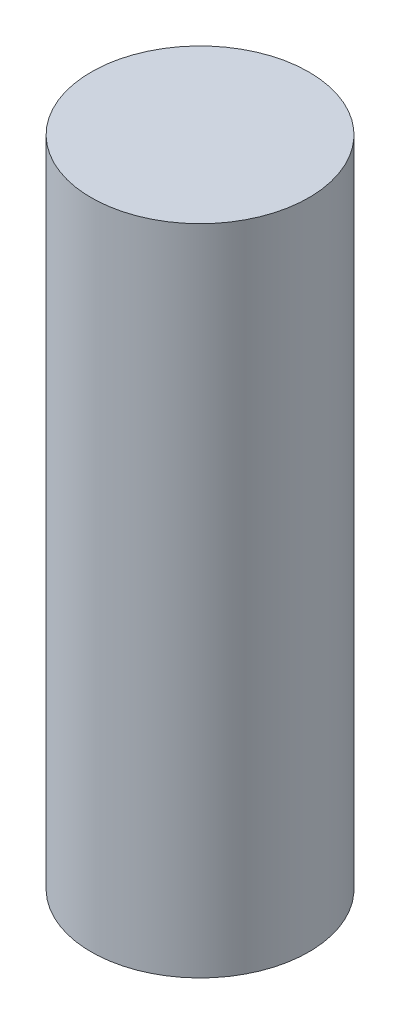
ISO-10303-21;
HEADER;
FILE_DESCRIPTION(('STEP AP214'),'2;1');
FILE_NAME('part.step','',(''),(''),'','','');
FILE_SCHEMA(('AUTOMOTIVE_DESIGN { 1 0 10303 214 1 1 1 1 }'));
ENDSEC;
DATA;
#1=APPLICATION_CONTEXT('core data for automotive mechanical design processes');
#2=APPLICATION_PROTOCOL_DEFINITION('international standard','automotive_design',2000,#1);
#3=PRODUCT_CONTEXT('',#1,'mechanical');
#4=PRODUCT('Part','Part','',(#3));
#5=PRODUCT_RELATED_PRODUCT_CATEGORY('part','',(#4));
#6=PRODUCT_DEFINITION_FORMATION('','',#4);
#7=PRODUCT_DEFINITION_CONTEXT('part definition',#1,'design');
#8=PRODUCT_DEFINITION('design','',#6,#7);
#9=PRODUCT_DEFINITION_SHAPE('','',#8);
#10=(LENGTH_UNIT() NAMED_UNIT(*) SI_UNIT(.MILLI.,.METRE.));
#11=(NAMED_UNIT(*) PLANE_ANGLE_UNIT() SI_UNIT($,.RADIAN.));
#12=(NAMED_UNIT(*) SI_UNIT($,.STERADIAN.) SOLID_ANGLE_UNIT());
#13=UNCERTAINTY_MEASURE_WITH_UNIT(LENGTH_MEASURE(1.E-05),#10,'distance_accuracy_value','');
#14=(GEOMETRIC_REPRESENTATION_CONTEXT(3) GLOBAL_UNCERTAINTY_ASSIGNED_CONTEXT((#13)) GLOBAL_UNIT_ASSIGNED_CONTEXT((#10,
#11,#12)) REPRESENTATION_CONTEXT('',''));
#15=CARTESIAN_POINT('',(0.,0.,0.));
#16=DIRECTION('',(0.,0.,1.));
#17=DIRECTION('',(1.,0.,0.));
#18=AXIS2_PLACEMENT_3D('',#15,#16,#17);
#19=CARTESIAN_POINT('',(0.,4.7625,0.));
#20=DIRECTION('',(0.,-1.,0.));
#21=DIRECTION('',(0.,0.,-1.));
#22=AXIS2_PLACEMENT_3D('',#19,#20,#21);
#23=CYLINDRICAL_SURFACE('',#22,1.5875);
#24=CARTESIAN_POINT('',(0.,4.7625,0.));
#25=DIRECTION('',(0.,1.,0.));
#26=DIRECTION('',(0.,0.,1.));
#27=AXIS2_PLACEMENT_3D('',#24,#25,#26);
#28=CIRCLE('',#27,1.5875);
#29=CARTESIAN_POINT('',(0.,4.7625,-1.5875));
#30=VERTEX_POINT('',#29);
#31=EDGE_CURVE('E10',#30,#30,#28,.T.);
#32=CARTESIAN_POINT('',(0.,-4.7625,0.));
#33=DIRECTION('',(0.,1.,0.));
#34=DIRECTION('',(0.,0.,1.));
#35=AXIS2_PLACEMENT_3D('',#32,#33,#34);
#36=CIRCLE('',#35,1.5875);
#37=CARTESIAN_POINT('',(0.,-4.7625,-1.5875));
#38=VERTEX_POINT('',#37);
#39=EDGE_CURVE('E36',#38,#38,#36,.T.);
#40=CARTESIAN_POINT('',(0.,4.7625,-1.5875));
#41=CARTESIAN_POINT('',(0.,4.66328125,-1.5875));
#42=CARTESIAN_POINT('',(0.,4.5640625,-1.5875));
#43=CARTESIAN_POINT('',(0.,4.365625,-1.5875));
#44=CARTESIAN_POINT('',(0.,4.26640625,-1.5875));
#45=CARTESIAN_POINT('',(0.,4.06796875,-1.5875));
#46=CARTESIAN_POINT('',(0.,3.96875,-1.5875));
#47=CARTESIAN_POINT('',(0.,3.7703125,-1.5875));
#48=CARTESIAN_POINT('',(0.,3.67109375,-1.5875));
#49=CARTESIAN_POINT('',(0.,3.47265625,-1.5875));
#50=CARTESIAN_POINT('',(0.,3.3734375,-1.5875));
#51=CARTESIAN_POINT('',(0.,3.175,-1.5875));
#52=CARTESIAN_POINT('',(0.,3.07578125,-1.5875));
#53=CARTESIAN_POINT('',(0.,2.87734375,-1.5875));
#54=CARTESIAN_POINT('',(0.,2.778125,-1.5875));
#55=CARTESIAN_POINT('',(0.,2.5796875,-1.5875));
#56=CARTESIAN_POINT('',(0.,2.48046875,-1.5875));
#57=CARTESIAN_POINT('',(0.,2.28203125,-1.5875));
#58=CARTESIAN_POINT('',(0.,2.1828125,-1.5875));
#59=CARTESIAN_POINT('',(0.,1.984375,-1.5875));
#60=CARTESIAN_POINT('',(0.,1.88515625,-1.5875));
#61=CARTESIAN_POINT('',(0.,1.68671875,-1.5875));
#62=CARTESIAN_POINT('',(0.,1.5875,-1.5875));
#63=CARTESIAN_POINT('',(0.,1.3890625,-1.5875));
#64=CARTESIAN_POINT('',(0.,1.28984375,-1.5875));
#65=CARTESIAN_POINT('',(0.,1.09140625,-1.5875));
#66=CARTESIAN_POINT('',(0.,0.992187499999999,-1.5875));
#67=CARTESIAN_POINT('',(0.,0.793749999999999,-1.5875));
#68=CARTESIAN_POINT('',(0.,0.694531249999999,-1.5875));
#69=CARTESIAN_POINT('',(0.,0.496093749999999,-1.5875));
#70=CARTESIAN_POINT('',(0.,0.396874999999999,-1.5875));
#71=CARTESIAN_POINT('',(0.,0.198437499999999,-1.5875));
#72=CARTESIAN_POINT('',(0.,0.0992187499999992,-1.5875));
#73=CARTESIAN_POINT('',(0.,-0.0992187500000009,-1.5875));
#74=CARTESIAN_POINT('',(0.,-0.198437500000001,-1.5875));
#75=CARTESIAN_POINT('',(0.,-0.396875000000001,-1.5875));
#76=CARTESIAN_POINT('',(0.,-0.496093750000001,-1.5875));
#77=CARTESIAN_POINT('',(0.,-0.694531250000001,-1.5875));
#78=CARTESIAN_POINT('',(0.,-0.793750000000001,-1.5875));
#79=CARTESIAN_POINT('',(0.,-0.992187500000002,-1.5875));
#80=CARTESIAN_POINT('',(0.,-1.09140625,-1.5875));
#81=CARTESIAN_POINT('',(0.,-1.28984375,-1.5875));
#82=CARTESIAN_POINT('',(0.,-1.3890625,-1.5875));
#83=CARTESIAN_POINT('',(0.,-1.5875,-1.5875));
#84=CARTESIAN_POINT('',(0.,-1.68671875,-1.5875));
#85=CARTESIAN_POINT('',(0.,-1.88515625,-1.5875));
#86=CARTESIAN_POINT('',(0.,-1.984375,-1.5875));
#87=CARTESIAN_POINT('',(0.,-2.1828125,-1.5875));
#88=CARTESIAN_POINT('',(0.,-2.28203125,-1.5875));
#89=CARTESIAN_POINT('',(0.,-2.48046875,-1.5875));
#90=CARTESIAN_POINT('',(0.,-2.5796875,-1.5875));
#91=CARTESIAN_POINT('',(0.,-2.778125,-1.5875));
#92=CARTESIAN_POINT('',(0.,-2.87734375,-1.5875));
#93=CARTESIAN_POINT('',(0.,-3.07578125,-1.5875));
#94=CARTESIAN_POINT('',(0.,-3.175,-1.5875));
#95=CARTESIAN_POINT('',(0.,-3.3734375,-1.5875));
#96=CARTESIAN_POINT('',(0.,-3.47265625,-1.5875));
#97=CARTESIAN_POINT('',(0.,-3.67109375,-1.5875));
#98=CARTESIAN_POINT('',(0.,-3.7703125,-1.5875));
#99=CARTESIAN_POINT('',(0.,-3.96875,-1.5875));
#100=CARTESIAN_POINT('',(0.,-4.06796875,-1.5875));
#101=CARTESIAN_POINT('',(0.,-4.26640625,-1.5875));
#102=CARTESIAN_POINT('',(0.,-4.365625,-1.5875));
#103=CARTESIAN_POINT('',(0.,-4.5640625,-1.5875));
#104=CARTESIAN_POINT('',(0.,-4.66328125,-1.5875));
#105=CARTESIAN_POINT('',(0.,-4.7625,-1.5875));
#106=B_SPLINE_CURVE_WITH_KNOTS('',3,(#40,#41,#42,#43,#44,#45,#46,#47,#48,#49,#50,#51,#52,#53,
#54,#55,#56,#57,#58,#59,#60,#61,#62,#63,#64,#65,#66,#67,#68,#69,#70,#71,#72,#73,#74,#75,#76,#77,
#78,#79,#80,#81,#82,#83,#84,#85,#86,#87,#88,#89,#90,#91,#92,#93,#94,#95,#96,#97,#98,#99,#100,
#101,#102,#103,#104,#105),.UNSPECIFIED.,.F.,.F.,(4,2,2,2,2,2,2,2,2,2,2,2,2,2,2,2,2,2,2,2,2,2,2,
2,2,2,2,2,2,2,2,2,4),(0.,0.297656249999999,0.595312499999999,0.89296875,1.190625,1.48828125,
1.7859375,2.08359375,2.38125,2.67890625,2.9765625,3.27421875,3.571875,3.86953125,4.1671875,
4.46484375,4.7625,5.06015625,5.3578125,5.65546875,5.953125,6.25078125,6.5484375,6.84609375,
7.14375,7.44140625,7.7390625,8.03671875,8.334375,8.63203125,8.9296875,9.22734375,9.525),.UNSPECIFIED.);
#107=EDGE_CURVE('BSEAM33',#30,#38,#106,.T.);
#108=ORIENTED_EDGE('',*,*,#31,.F.);
#109=ORIENTED_EDGE('',*,*,#39,.T.);
#110=ORIENTED_EDGE('',*,*,#107,.T.);
#111=ORIENTED_EDGE('',*,*,#107,.F.);
#112=EDGE_LOOP('',(#108,#110,#109,#111));
#113=FACE_BOUND('',#112,.T.);
#114=ADVANCED_FACE('F33',(#113),#23,.T.);
#115=CARTESIAN_POINT('',(0.,4.7625,0.));
#116=DIRECTION('',(0.,1.,0.));
#117=DIRECTION('',(0.,0.,1.));
#118=AXIS2_PLACEMENT_3D('',#115,#116,#117);
#119=PLANE('',#118);
#120=ORIENTED_EDGE('',*,*,#31,.T.);
#121=EDGE_LOOP('',(#120));
#122=FACE_BOUND('',#121,.T.);
#123=ADVANCED_FACE('F48',(#122),#119,.T.);
#124=CARTESIAN_POINT('',(0.,-4.7625,0.));
#125=DIRECTION('',(0.,1.,0.));
#126=DIRECTION('',(0.,0.,1.));
#127=AXIS2_PLACEMENT_3D('',#124,#125,#126);
#128=PLANE('',#127);
#129=ORIENTED_EDGE('',*,*,#39,.F.);
#130=EDGE_LOOP('',(#129));
#131=FACE_BOUND('',#130,.T.);
#132=ADVANCED_FACE('F46',(#131),#128,.F.);
#133=CLOSED_SHELL('',(#114,#123,#132));
#134=MANIFOLD_SOLID_BREP('B2',#133);
#135=ADVANCED_BREP_SHAPE_REPRESENTATION('',(#18,#134),#14);
#136=SHAPE_DEFINITION_REPRESENTATION(#9,#135);
ENDSEC;
END-ISO-10303-21;
